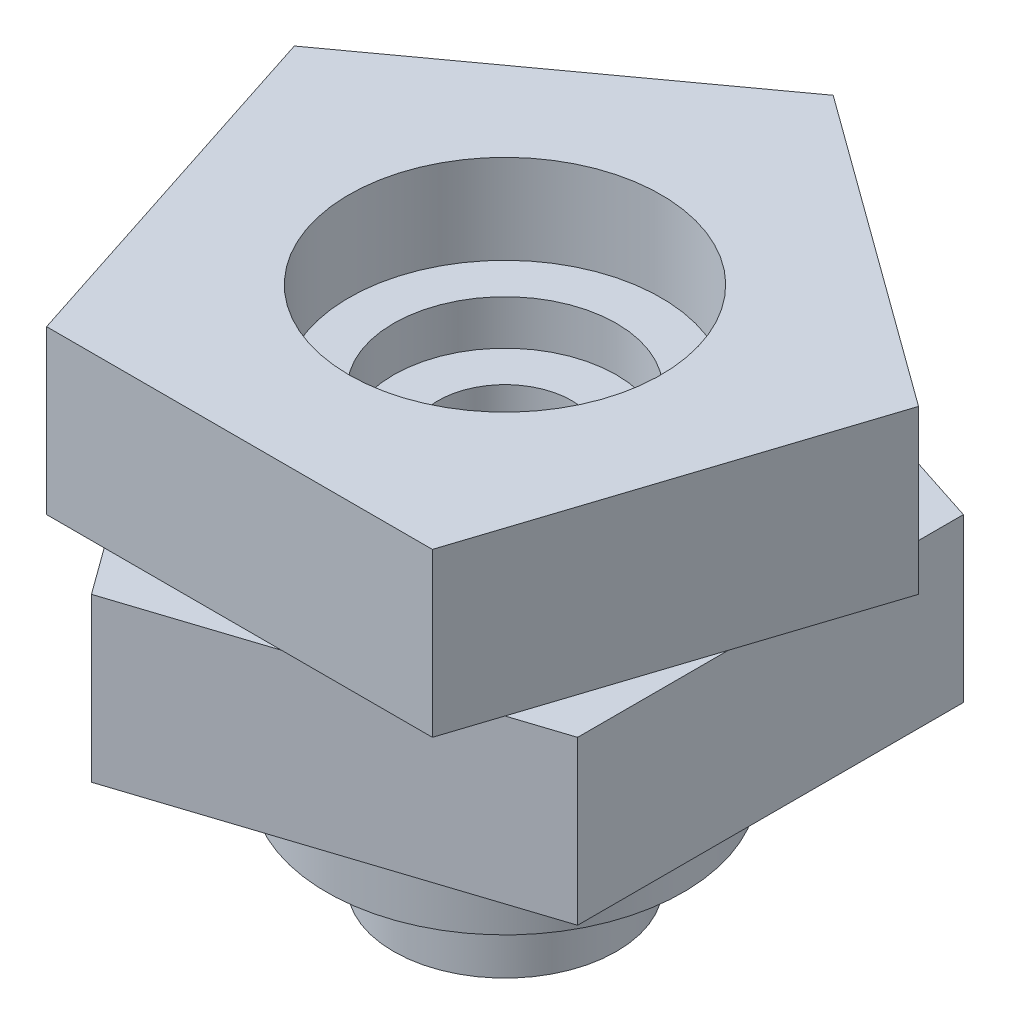
ISO-10303-21;
HEADER;
FILE_DESCRIPTION(('STEP AP214'),'2;1');
FILE_NAME('part.step','',(''),(''),'','','');
FILE_SCHEMA(('AUTOMOTIVE_DESIGN { 1 0 10303 214 1 1 1 1 }'));
ENDSEC;
DATA;
#1=APPLICATION_CONTEXT('core data for automotive mechanical design processes');
#2=APPLICATION_PROTOCOL_DEFINITION('international standard','automotive_design',2000,#1);
#3=PRODUCT_CONTEXT('',#1,'mechanical');
#4=PRODUCT('Part','Part','',(#3));
#5=PRODUCT_RELATED_PRODUCT_CATEGORY('part','',(#4));
#6=PRODUCT_DEFINITION_FORMATION('','',#4);
#7=PRODUCT_DEFINITION_CONTEXT('part definition',#1,'design');
#8=PRODUCT_DEFINITION('design','',#6,#7);
#9=PRODUCT_DEFINITION_SHAPE('','',#8);
#10=(LENGTH_UNIT() NAMED_UNIT(*) SI_UNIT(.MILLI.,.METRE.));
#11=(NAMED_UNIT(*) PLANE_ANGLE_UNIT() SI_UNIT($,.RADIAN.));
#12=(NAMED_UNIT(*) SI_UNIT($,.STERADIAN.) SOLID_ANGLE_UNIT());
#13=UNCERTAINTY_MEASURE_WITH_UNIT(LENGTH_MEASURE(1.E-05),#10,'distance_accuracy_value','');
#14=(GEOMETRIC_REPRESENTATION_CONTEXT(3) GLOBAL_UNCERTAINTY_ASSIGNED_CONTEXT((#13)) GLOBAL_UNIT_ASSIGNED_CONTEXT((#10,
#11,#12)) REPRESENTATION_CONTEXT('',''));
#15=CARTESIAN_POINT('',(0.,0.,0.));
#16=DIRECTION('',(0.,0.,1.));
#17=DIRECTION('',(1.,0.,0.));
#18=AXIS2_PLACEMENT_3D('',#15,#16,#17);
#19=CARTESIAN_POINT('',(0.,-6.15,0.));
#20=DIRECTION('',(0.,-1.,0.));
#21=DIRECTION('',(0.,0.,-1.));
#22=AXIS2_PLACEMENT_3D('',#19,#20,#21);
#23=PLANE('',#22);
#24=CARTESIAN_POINT('',(0.,-6.15,0.));
#25=DIRECTION('',(0.,-1.,0.));
#26=DIRECTION('',(0.,0.,-1.));
#27=AXIS2_PLACEMENT_3D('',#24,#25,#26);
#28=CIRCLE('',#27,4.);
#29=CARTESIAN_POINT('',(0.,-6.15,-4.));
#30=VERTEX_POINT('',#29);
#31=EDGE_CURVE('E167',#30,#30,#28,.T.);
#32=ORIENTED_EDGE('',*,*,#31,.T.);
#33=EDGE_LOOP('',(#32));
#34=FACE_BOUND('',#33,.T.);
#35=CARTESIAN_POINT('',(0.,-6.15,0.));
#36=DIRECTION('',(0.,-1.,0.));
#37=DIRECTION('',(0.,0.,-1.));
#38=AXIS2_PLACEMENT_3D('',#35,#36,#37);
#39=CIRCLE('',#38,2.5);
#40=CARTESIAN_POINT('',(0.,-6.15,2.5));
#41=VERTEX_POINT('',#40);
#42=EDGE_CURVE('E174',#41,#41,#39,.T.);
#43=ORIENTED_EDGE('',*,*,#42,.F.);
#44=EDGE_LOOP('',(#43));
#45=FACE_BOUND('',#44,.T.);
#46=ADVANCED_FACE('F39',(#34,#45),#23,.T.);
#47=CARTESIAN_POINT('',(0.,3.65,0.));
#48=DIRECTION('',(0.,-1.,0.));
#49=DIRECTION('',(0.,0.,-1.));
#50=AXIS2_PLACEMENT_3D('',#47,#48,#49);
#51=CYLINDRICAL_SURFACE('',#50,1.5);
#52=CARTESIAN_POINT('',(0.,0.65,0.));
#53=DIRECTION('',(0.,1.,0.));
#54=DIRECTION('',(0.,0.,1.));
#55=AXIS2_PLACEMENT_3D('',#52,#53,#54);
#56=CIRCLE('',#55,1.5);
#57=CARTESIAN_POINT('',(-1.29903810567666,0.65,0.750000000000001));
#58=VERTEX_POINT('',#57);
#59=CARTESIAN_POINT('',(1.29903810567666,0.65,0.750000000000001));
#60=VERTEX_POINT('',#59);
#61=EDGE_CURVE('E53',#58,#60,#56,.F.);
#62=ORIENTED_EDGE('',*,*,#61,.F.);
#63=DIRECTION('',(0.,-1.,0.));
#64=VECTOR('',#63,1.);
#65=CARTESIAN_POINT('',(-1.29903810567666,3.65,0.750000000000001));
#66=LINE('',#65,#64);
#67=CARTESIAN_POINT('',(-1.29903810567666,-8.05,0.750000000000001));
#68=VERTEX_POINT('',#67);
#69=EDGE_CURVE('E158',#58,#68,#66,.T.);
#70=ORIENTED_EDGE('',*,*,#69,.T.);
#71=CARTESIAN_POINT('',(0.,-8.05,0.));
#72=DIRECTION('',(0.,-1.,0.));
#73=DIRECTION('',(0.,0.,-1.));
#74=AXIS2_PLACEMENT_3D('',#71,#72,#73);
#75=CIRCLE('',#74,1.5);
#76=CARTESIAN_POINT('',(1.29903810567666,-8.05,0.750000000000001));
#77=VERTEX_POINT('',#76);
#78=EDGE_CURVE('E163',#68,#77,#75,.T.);
#79=ORIENTED_EDGE('',*,*,#78,.T.);
#80=DIRECTION('',(0.,-1.,0.));
#81=VECTOR('',#80,1.);
#82=CARTESIAN_POINT('',(1.29903810567666,3.65,0.750000000000001));
#83=LINE('',#82,#81);
#84=EDGE_CURVE('E168',#60,#77,#83,.T.);
#85=ORIENTED_EDGE('',*,*,#84,.F.);
#86=EDGE_LOOP('',(#62,#70,#79,#85));
#87=FACE_BOUND('',#86,.T.);
#88=ADVANCED_FACE('F160',(#87),#51,.F.);
#89=CARTESIAN_POINT('',(-1.29903810567666,3.65,0.750000000000001));
#90=DIRECTION('',(0.,0.,1.));
#91=DIRECTION('',(1.,0.,0.));
#92=AXIS2_PLACEMENT_3D('',#89,#90,#91);
#93=PLANE('',#92);
#94=DIRECTION('',(-1.,0.,0.));
#95=VECTOR('',#94,1.);
#96=CARTESIAN_POINT('',(-1.29903810567666,0.65,0.750000000000001));
#97=LINE('',#96,#95);
#98=EDGE_CURVE('E11',#60,#58,#97,.T.);
#99=ORIENTED_EDGE('',*,*,#98,.F.);
#100=ORIENTED_EDGE('',*,*,#84,.T.);
#101=DIRECTION('',(-1.,0.,0.));
#102=VECTOR('',#101,1.);
#103=CARTESIAN_POINT('',(1.29903810567666,-8.05,0.750000000000001));
#104=LINE('',#103,#102);
#105=EDGE_CURVE('E170',#77,#68,#104,.T.);
#106=ORIENTED_EDGE('',*,*,#105,.T.);
#107=ORIENTED_EDGE('',*,*,#69,.F.);
#108=EDGE_LOOP('',(#99,#100,#106,#107));
#109=FACE_BOUND('',#108,.T.);
#110=ADVANCED_FACE('F171',(#109),#93,.F.);
#111=CARTESIAN_POINT('',(0.,0.,0.));
#112=DIRECTION('',(0.,1.,0.));
#113=DIRECTION('',(0.,0.,1.));
#114=AXIS2_PLACEMENT_3D('',#111,#112,#113);
#115=PLANE('',#114);
#116=DIRECTION('',(0.309016994374949,0.,0.951056516295153));
#117=VECTOR('',#116,1.);
#118=CARTESIAN_POINT('',(-6.99977595993234,0.,-2.2743650785996));
#119=LINE('',#118,#117);
#120=CARTESIAN_POINT('',(-5.37151033820532,0.,2.73692121953803));
#121=VERTEX_POINT('',#120);
#122=CARTESIAN_POINT('',(-4.32609945687259,0.,5.95436507859962));
#123=VERTEX_POINT('',#122);
#124=EDGE_CURVE('E310',#121,#123,#119,.T.);
#125=ORIENTED_EDGE('',*,*,#124,.F.);
#126=DIRECTION('',(0.587785252292473,0.,0.809016994374948));
#127=VECTOR('',#126,1.);
#128=CARTESIAN_POINT('',(-7.36,0.,0.));
#129=LINE('',#128,#127);
#130=CARTESIAN_POINT('',(-3.0339005431274,0.,5.95436507859962));
#131=VERTEX_POINT('',#130);
#132=EDGE_CURVE('E206',#121,#131,#129,.T.);
#133=ORIENTED_EDGE('',*,*,#132,.T.);
#134=DIRECTION('',(1.,0.,0.));
#135=VECTOR('',#134,1.);
#136=CARTESIAN_POINT('',(-4.32609945687259,0.,5.95436507859962));
#137=LINE('',#136,#135);
#138=EDGE_CURVE('E318',#123,#131,#137,.T.);
#139=ORIENTED_EDGE('',*,*,#138,.F.);
#140=EDGE_LOOP('',(#125,#133,#139));
#141=FACE_BOUND('',#140,.T.);
#142=ADVANCED_FACE('F443',(#141),#115,.F.);
#143=CARTESIAN_POINT('',(0.943078780461964,0.,5.95436507859961));
#144=VERTEX_POINT('',#143);
#145=CARTESIAN_POINT('',(4.32609945687261,0.,5.95436507859961));
#146=VERTEX_POINT('',#145);
#147=EDGE_CURVE('E316',#144,#146,#137,.T.);
#148=ORIENTED_EDGE('',*,*,#147,.F.);
#149=DIRECTION('',(0.951056516295154,0.,-0.309016994374947));
#150=VECTOR('',#149,1.);
#151=CARTESIAN_POINT('',(-2.27436507859962,0.,6.99977595993233));
#152=LINE('',#151,#150);
#153=CARTESIAN_POINT('',(4.72541088133272,0.,4.72541088133272));
#154=VERTEX_POINT('',#153);
#155=EDGE_CURVE('E247',#144,#154,#152,.T.);
#156=ORIENTED_EDGE('',*,*,#155,.T.);
#157=DIRECTION('',(0.309016994374946,0.,-0.951056516295154));
#158=VECTOR('',#157,1.);
#159=CARTESIAN_POINT('',(4.32609945687261,0.,5.95436507859961));
#160=LINE('',#159,#158);
#161=EDGE_CURVE('E287',#146,#154,#160,.T.);
#162=ORIENTED_EDGE('',*,*,#161,.F.);
#163=EDGE_LOOP('',(#148,#156,#162));
#164=FACE_BOUND('',#163,.T.);
#165=ADVANCED_FACE('F385',(#164),#115,.F.);
#166=CARTESIAN_POINT('',(5.95436507859961,0.,0.943078780461952));
#167=VERTEX_POINT('',#166);
#168=CARTESIAN_POINT('',(6.99977595993233,0.,-2.27436507859963));
#169=VERTEX_POINT('',#168);
#170=EDGE_CURVE('E322',#167,#169,#160,.T.);
#171=ORIENTED_EDGE('',*,*,#170,.F.);
#172=DIRECTION('',(0.,0.,-1.));
#173=VECTOR('',#172,1.);
#174=CARTESIAN_POINT('',(5.95436507859961,0.,4.32609945687261));
#175=LINE('',#174,#173);
#176=CARTESIAN_POINT('',(5.95436507859962,0.,-3.0339005431274));
#177=VERTEX_POINT('',#176);
#178=EDGE_CURVE('E253',#167,#177,#175,.T.);
#179=ORIENTED_EDGE('',*,*,#178,.T.);
#180=DIRECTION('',(-0.809016994374948,0.,-0.587785252292473));
#181=VECTOR('',#180,1.);
#182=CARTESIAN_POINT('',(6.99977595993233,0.,-2.27436507859963));
#183=LINE('',#182,#181);
#184=EDGE_CURVE('E300',#169,#177,#183,.T.);
#185=ORIENTED_EDGE('',*,*,#184,.F.);
#186=EDGE_LOOP('',(#171,#179,#185));
#187=FACE_BOUND('',#186,.T.);
#188=ADVANCED_FACE('F406',(#187),#115,.F.);
#189=CARTESIAN_POINT('',(2.73692121953806,0.,-5.37151033820531));
#190=VERTEX_POINT('',#189);
#191=CARTESIAN_POINT('',(0.,0.,-7.36));
#192=VERTEX_POINT('',#191);
#193=EDGE_CURVE('E266',#190,#192,#183,.T.);
#194=ORIENTED_EDGE('',*,*,#193,.F.);
#195=DIRECTION('',(-0.951056516295154,0.,-0.309016994374948));
#196=VECTOR('',#195,1.);
#197=CARTESIAN_POINT('',(5.95436507859962,0.,-4.3260994568726));
#198=LINE('',#197,#196);
#199=CARTESIAN_POINT('',(-1.04541088133272,0.,-6.60046453547222));
#200=VERTEX_POINT('',#199);
#201=EDGE_CURVE('E258',#190,#200,#198,.T.);
#202=ORIENTED_EDGE('',*,*,#201,.T.);
#203=DIRECTION('',(-0.809016994374947,0.,0.587785252292474));
#204=VECTOR('',#203,1.);
#205=CARTESIAN_POINT('',(0.,0.,-7.36));
#206=LINE('',#205,#204);
#207=EDGE_CURVE('E306',#192,#200,#206,.T.);
#208=ORIENTED_EDGE('',*,*,#207,.F.);
#209=EDGE_LOOP('',(#194,#202,#208));
#210=FACE_BOUND('',#209,.T.);
#211=ADVANCED_FACE('F424',(#210),#115,.F.);
#212=CARTESIAN_POINT('',(6.99977595993233,3.65,-2.27436507859963));
#213=DIRECTION('',(-0.587785252292473,0.,0.809016994374948));
#214=DIRECTION('',(0.809016994374948,0.,0.587785252292473));
#215=AXIS2_PLACEMENT_3D('',#212,#213,#214);
#216=PLANE('',#215);
#217=ORIENTED_EDGE('',*,*,#184,.T.);
#218=EDGE_CURVE('E305',#177,#190,#183,.T.);
#219=ORIENTED_EDGE('',*,*,#218,.T.);
#220=ORIENTED_EDGE('',*,*,#193,.T.);
#221=DIRECTION('',(0.,-1.,0.));
#222=VECTOR('',#221,1.);
#223=CARTESIAN_POINT('',(0.,3.65,-7.36));
#224=LINE('',#223,#222);
#225=CARTESIAN_POINT('',(0.,3.65,-7.36));
#226=VERTEX_POINT('',#225);
#227=EDGE_CURVE('E342',#226,#192,#224,.T.);
#228=ORIENTED_EDGE('',*,*,#227,.F.);
#229=DIRECTION('',(-0.809016994374948,0.,-0.587785252292473));
#230=VECTOR('',#229,1.);
#231=CARTESIAN_POINT('',(6.99977595993233,3.65,-2.27436507859963));
#232=LINE('',#231,#230);
#233=CARTESIAN_POINT('',(6.99977595993233,3.65,-2.27436507859963));
#234=VERTEX_POINT('',#233);
#235=EDGE_CURVE('E282',#234,#226,#232,.T.);
#236=ORIENTED_EDGE('',*,*,#235,.F.);
#237=DIRECTION('',(0.,-1.,0.));
#238=VECTOR('',#237,1.);
#239=CARTESIAN_POINT('',(6.99977595993233,3.65,-2.27436507859963));
#240=LINE('',#239,#238);
#241=EDGE_CURVE('E299',#234,#169,#240,.T.);
#242=ORIENTED_EDGE('',*,*,#241,.T.);
#243=EDGE_LOOP('',(#217,#219,#220,#228,#236,#242));
#244=FACE_BOUND('',#243,.T.);
#245=ADVANCED_FACE('F41',(#244),#216,.F.);
#246=CARTESIAN_POINT('',(0.,3.65,-7.36));
#247=DIRECTION('',(0.587785252292474,0.,0.809016994374947));
#248=DIRECTION('',(0.809016994374947,0.,-0.587785252292474));
#249=AXIS2_PLACEMENT_3D('',#246,#247,#248);
#250=PLANE('',#249);
#251=ORIENTED_EDGE('',*,*,#207,.T.);
#252=CARTESIAN_POINT('',(-4.2628547403943,0.,-4.26285474039429));
#253=VERTEX_POINT('',#252);
#254=EDGE_CURVE('E311',#200,#253,#206,.T.);
#255=ORIENTED_EDGE('',*,*,#254,.T.);
#256=CARTESIAN_POINT('',(-6.99977595993234,0.,-2.2743650785996));
#257=VERTEX_POINT('',#256);
#258=EDGE_CURVE('E304',#253,#257,#206,.T.);
#259=ORIENTED_EDGE('',*,*,#258,.T.);
#260=DIRECTION('',(0.,-1.,0.));
#261=VECTOR('',#260,1.);
#262=CARTESIAN_POINT('',(-6.99977595993234,3.65,-2.2743650785996));
#263=LINE('',#262,#261);
#264=CARTESIAN_POINT('',(-6.99977595993234,3.65,-2.2743650785996));
#265=VERTEX_POINT('',#264);
#266=EDGE_CURVE('E339',#265,#257,#263,.T.);
#267=ORIENTED_EDGE('',*,*,#266,.F.);
#268=DIRECTION('',(-0.809016994374947,0.,0.587785252292474));
#269=VECTOR('',#268,1.);
#270=CARTESIAN_POINT('',(0.,3.65,-7.36));
#271=LINE('',#270,#269);
#272=EDGE_CURVE('E286',#226,#265,#271,.T.);
#273=ORIENTED_EDGE('',*,*,#272,.F.);
#274=ORIENTED_EDGE('',*,*,#227,.T.);
#275=EDGE_LOOP('',(#251,#255,#259,#267,#273,#274));
#276=FACE_BOUND('',#275,.T.);
#277=ADVANCED_FACE('F426',(#276),#250,.F.);
#278=CARTESIAN_POINT('',(-6.99977595993234,3.65,-2.2743650785996));
#279=DIRECTION('',(0.951056516295153,0.,-0.309016994374949));
#280=DIRECTION('',(-0.309016994374949,0.,-0.951056516295153));
#281=AXIS2_PLACEMENT_3D('',#278,#279,#280);
#282=PLANE('',#281);
#283=CARTESIAN_POINT('',(-6.60046453547222,0.,-1.04541088133271));
#284=VERTEX_POINT('',#283);
#285=EDGE_CURVE('E312',#257,#284,#119,.T.);
#286=ORIENTED_EDGE('',*,*,#285,.T.);
#287=EDGE_CURVE('E317',#284,#121,#119,.T.);
#288=ORIENTED_EDGE('',*,*,#287,.T.);
#289=ORIENTED_EDGE('',*,*,#124,.T.);
#290=DIRECTION('',(0.,-1.,0.));
#291=VECTOR('',#290,1.);
#292=CARTESIAN_POINT('',(-4.32609945687259,3.65,5.95436507859962));
#293=LINE('',#292,#291);
#294=CARTESIAN_POINT('',(-4.32609945687259,3.65,5.95436507859962));
#295=VERTEX_POINT('',#294);
#296=EDGE_CURVE('E335',#295,#123,#293,.T.);
#297=ORIENTED_EDGE('',*,*,#296,.F.);
#298=DIRECTION('',(0.309016994374949,0.,0.951056516295153));
#299=VECTOR('',#298,1.);
#300=CARTESIAN_POINT('',(-6.99977595993234,3.65,-2.2743650785996));
#301=LINE('',#300,#299);
#302=EDGE_CURVE('E290',#265,#295,#301,.T.);
#303=ORIENTED_EDGE('',*,*,#302,.F.);
#304=ORIENTED_EDGE('',*,*,#266,.T.);
#305=EDGE_LOOP('',(#286,#288,#289,#297,#303,#304));
#306=FACE_BOUND('',#305,.T.);
#307=ADVANCED_FACE('F436',(#306),#282,.F.);
#308=CARTESIAN_POINT('',(-4.32609945687259,3.65,5.95436507859962));
#309=DIRECTION('',(0.,0.,-1.));
#310=DIRECTION('',(-1.,0.,0.));
#311=AXIS2_PLACEMENT_3D('',#308,#309,#310);
#312=PLANE('',#311);
#313=ORIENTED_EDGE('',*,*,#138,.T.);
#314=EDGE_CURVE('E323',#131,#144,#137,.T.);
#315=ORIENTED_EDGE('',*,*,#314,.T.);
#316=ORIENTED_EDGE('',*,*,#147,.T.);
#317=DIRECTION('',(0.,-1.,0.));
#318=VECTOR('',#317,1.);
#319=CARTESIAN_POINT('',(4.32609945687261,3.65,5.95436507859961));
#320=LINE('',#319,#318);
#321=CARTESIAN_POINT('',(4.32609945687261,3.65,5.95436507859961));
#322=VERTEX_POINT('',#321);
#323=EDGE_CURVE('E331',#322,#146,#320,.T.);
#324=ORIENTED_EDGE('',*,*,#323,.F.);
#325=DIRECTION('',(1.,0.,0.));
#326=VECTOR('',#325,1.);
#327=CARTESIAN_POINT('',(-4.32609945687259,3.65,5.95436507859962));
#328=LINE('',#327,#326);
#329=EDGE_CURVE('E293',#295,#322,#328,.T.);
#330=ORIENTED_EDGE('',*,*,#329,.F.);
#331=ORIENTED_EDGE('',*,*,#296,.T.);
#332=EDGE_LOOP('',(#313,#315,#316,#324,#330,#331));
#333=FACE_BOUND('',#332,.T.);
#334=ADVANCED_FACE('F394',(#333),#312,.F.);
#335=CARTESIAN_POINT('',(4.32609945687261,3.65,5.95436507859961));
#336=DIRECTION('',(-0.951056516295154,0.,-0.309016994374946));
#337=DIRECTION('',(-0.309016994374946,0.,0.951056516295154));
#338=AXIS2_PLACEMENT_3D('',#335,#336,#337);
#339=PLANE('',#338);
#340=ORIENTED_EDGE('',*,*,#161,.T.);
#341=EDGE_CURVE('E327',#154,#167,#160,.T.);
#342=ORIENTED_EDGE('',*,*,#341,.T.);
#343=ORIENTED_EDGE('',*,*,#170,.T.);
#344=ORIENTED_EDGE('',*,*,#241,.F.);
#345=DIRECTION('',(0.309016994374946,0.,-0.951056516295154));
#346=VECTOR('',#345,1.);
#347=CARTESIAN_POINT('',(4.32609945687261,3.65,5.95436507859961));
#348=LINE('',#347,#346);
#349=EDGE_CURVE('E296',#322,#234,#348,.T.);
#350=ORIENTED_EDGE('',*,*,#349,.F.);
#351=ORIENTED_EDGE('',*,*,#323,.T.);
#352=EDGE_LOOP('',(#340,#342,#343,#344,#350,#351));
#353=FACE_BOUND('',#352,.T.);
#354=ADVANCED_FACE('F388',(#353),#339,.F.);
#355=CARTESIAN_POINT('',(0.,3.65,0.));
#356=DIRECTION('',(0.,1.,0.));
#357=DIRECTION('',(0.,0.,1.));
#358=AXIS2_PLACEMENT_3D('',#355,#356,#357);
#359=PLANE('',#358);
#360=CARTESIAN_POINT('',(0.,3.65,0.));
#361=DIRECTION('',(0.,1.,0.));
#362=DIRECTION('',(0.,0.,1.));
#363=AXIS2_PLACEMENT_3D('',#360,#361,#362);
#364=CIRCLE('',#363,3.5);
#365=CARTESIAN_POINT('',(0.,3.65,3.5));
#366=VERTEX_POINT('',#365);
#367=EDGE_CURVE('E202',#366,#366,#364,.T.);
#368=ORIENTED_EDGE('',*,*,#367,.F.);
#369=EDGE_LOOP('',(#368));
#370=FACE_BOUND('',#369,.T.);
#371=ORIENTED_EDGE('',*,*,#235,.T.);
#372=ORIENTED_EDGE('',*,*,#272,.T.);
#373=ORIENTED_EDGE('',*,*,#302,.T.);
#374=ORIENTED_EDGE('',*,*,#329,.T.);
#375=ORIENTED_EDGE('',*,*,#349,.T.);
#376=EDGE_LOOP('',(#371,#372,#373,#374,#375));
#377=FACE_BOUND('',#376,.T.);
#378=ADVANCED_FACE('F441',(#370,#377),#359,.T.);
#379=ORIENTED_EDGE('',*,*,#258,.F.);
#380=DIRECTION('',(-0.587785252292474,0.,0.809016994374947));
#381=VECTOR('',#380,1.);
#382=CARTESIAN_POINT('',(-2.27436507859961,0.,-6.99977595993233));
#383=LINE('',#382,#381);
#384=EDGE_CURVE('E262',#253,#284,#383,.T.);
#385=ORIENTED_EDGE('',*,*,#384,.T.);
#386=ORIENTED_EDGE('',*,*,#285,.F.);
#387=EDGE_LOOP('',(#379,#385,#386));
#388=FACE_BOUND('',#387,.T.);
#389=ADVANCED_FACE('F439',(#388),#115,.F.);
#390=CARTESIAN_POINT('',(0.,0.,0.));
#391=DIRECTION('',(0.,1.,0.));
#392=DIRECTION('',(0.,0.,1.));
#393=AXIS2_PLACEMENT_3D('',#390,#391,#392);
#394=PLANE('',#393);
#395=ORIENTED_EDGE('',*,*,#218,.F.);
#396=CARTESIAN_POINT('',(5.95436507859962,0.,-4.3260994568726));
#397=VERTEX_POINT('',#396);
#398=EDGE_CURVE('E246',#177,#397,#175,.T.);
#399=ORIENTED_EDGE('',*,*,#398,.T.);
#400=EDGE_CURVE('E254',#397,#190,#198,.T.);
#401=ORIENTED_EDGE('',*,*,#400,.T.);
#402=EDGE_LOOP('',(#395,#399,#401));
#403=FACE_BOUND('',#402,.T.);
#404=ADVANCED_FACE('F413',(#403),#394,.T.);
#405=ORIENTED_EDGE('',*,*,#341,.F.);
#406=CARTESIAN_POINT('',(5.95436507859961,0.,4.32609945687261));
#407=VERTEX_POINT('',#406);
#408=EDGE_CURVE('E241',#154,#407,#152,.T.);
#409=ORIENTED_EDGE('',*,*,#408,.T.);
#410=EDGE_CURVE('E248',#407,#167,#175,.T.);
#411=ORIENTED_EDGE('',*,*,#410,.T.);
#412=EDGE_LOOP('',(#405,#409,#411));
#413=FACE_BOUND('',#412,.T.);
#414=ADVANCED_FACE('F448',(#413),#394,.T.);
#415=ORIENTED_EDGE('',*,*,#314,.F.);
#416=CARTESIAN_POINT('',(-2.27436507859962,0.,6.99977595993233));
#417=VERTEX_POINT('',#416);
#418=EDGE_CURVE('E211',#131,#417,#129,.T.);
#419=ORIENTED_EDGE('',*,*,#418,.T.);
#420=EDGE_CURVE('E242',#417,#144,#152,.T.);
#421=ORIENTED_EDGE('',*,*,#420,.T.);
#422=EDGE_LOOP('',(#415,#419,#421));
#423=FACE_BOUND('',#422,.T.);
#424=ADVANCED_FACE('F375',(#423),#394,.T.);
#425=ORIENTED_EDGE('',*,*,#287,.F.);
#426=CARTESIAN_POINT('',(-7.36,0.,0.));
#427=VERTEX_POINT('',#426);
#428=EDGE_CURVE('E61',#284,#427,#383,.T.);
#429=ORIENTED_EDGE('',*,*,#428,.T.);
#430=EDGE_CURVE('E237',#427,#121,#129,.T.);
#431=ORIENTED_EDGE('',*,*,#430,.T.);
#432=EDGE_LOOP('',(#425,#429,#431));
#433=FACE_BOUND('',#432,.T.);
#434=ADVANCED_FACE('F356',(#433),#394,.T.);
#435=ORIENTED_EDGE('',*,*,#254,.F.);
#436=CARTESIAN_POINT('',(-2.27436507859961,0.,-6.99977595993233));
#437=VERTEX_POINT('',#436);
#438=EDGE_CURVE('E252',#200,#437,#198,.T.);
#439=ORIENTED_EDGE('',*,*,#438,.T.);
#440=EDGE_CURVE('E220',#437,#253,#383,.T.);
#441=ORIENTED_EDGE('',*,*,#440,.T.);
#442=EDGE_LOOP('',(#435,#439,#441));
#443=FACE_BOUND('',#442,.T.);
#444=ADVANCED_FACE('F450',(#443),#394,.T.);
#445=CARTESIAN_POINT('',(-7.36,-3.65,0.));
#446=DIRECTION('',(-0.809016994374948,0.,0.587785252292473));
#447=DIRECTION('',(0.587785252292473,0.,0.809016994374948));
#448=AXIS2_PLACEMENT_3D('',#445,#446,#447);
#449=PLANE('',#448);
#450=ORIENTED_EDGE('',*,*,#430,.F.);
#451=DIRECTION('',(0.,1.,0.));
#452=VECTOR('',#451,1.);
#453=CARTESIAN_POINT('',(-7.36,-3.65,0.));
#454=LINE('',#453,#452);
#455=CARTESIAN_POINT('',(-7.36,-3.65,0.));
#456=VERTEX_POINT('',#455);
#457=EDGE_CURVE('E263',#456,#427,#454,.T.);
#458=ORIENTED_EDGE('',*,*,#457,.F.);
#459=DIRECTION('',(0.587785252292473,0.,0.809016994374948));
#460=VECTOR('',#459,1.);
#461=CARTESIAN_POINT('',(-7.36,-3.65,0.));
#462=LINE('',#461,#460);
#463=CARTESIAN_POINT('',(-2.27436507859962,-3.65,6.99977595993233));
#464=VERTEX_POINT('',#463);
#465=EDGE_CURVE('E215',#456,#464,#462,.T.);
#466=ORIENTED_EDGE('',*,*,#465,.T.);
#467=DIRECTION('',(0.,1.,0.));
#468=VECTOR('',#467,1.);
#469=CARTESIAN_POINT('',(-2.27436507859962,-3.65,6.99977595993233));
#470=LINE('',#469,#468);
#471=EDGE_CURVE('E236',#464,#417,#470,.T.);
#472=ORIENTED_EDGE('',*,*,#471,.T.);
#473=ORIENTED_EDGE('',*,*,#418,.F.);
#474=ORIENTED_EDGE('',*,*,#132,.F.);
#475=EDGE_LOOP('',(#450,#458,#466,#472,#473,#474));
#476=FACE_BOUND('',#475,.T.);
#477=ADVANCED_FACE('F365',(#476),#449,.T.);
#478=CARTESIAN_POINT('',(-2.27436507859961,-3.65,-6.99977595993233));
#479=DIRECTION('',(-0.809016994374947,0.,-0.587785252292474));
#480=DIRECTION('',(-0.587785252292474,0.,0.809016994374947));
#481=AXIS2_PLACEMENT_3D('',#478,#479,#480);
#482=PLANE('',#481);
#483=ORIENTED_EDGE('',*,*,#440,.F.);
#484=DIRECTION('',(0.,1.,0.));
#485=VECTOR('',#484,1.);
#486=CARTESIAN_POINT('',(-2.27436507859961,-3.65,-6.99977595993233));
#487=LINE('',#486,#485);
#488=CARTESIAN_POINT('',(-2.27436507859961,-3.65,-6.99977595993233));
#489=VERTEX_POINT('',#488);
#490=EDGE_CURVE('E267',#489,#437,#487,.T.);
#491=ORIENTED_EDGE('',*,*,#490,.F.);
#492=DIRECTION('',(-0.587785252292474,0.,0.809016994374947));
#493=VECTOR('',#492,1.);
#494=CARTESIAN_POINT('',(-2.27436507859961,-3.65,-6.99977595993233));
#495=LINE('',#494,#493);
#496=EDGE_CURVE('E232',#489,#456,#495,.T.);
#497=ORIENTED_EDGE('',*,*,#496,.T.);
#498=ORIENTED_EDGE('',*,*,#457,.T.);
#499=ORIENTED_EDGE('',*,*,#428,.F.);
#500=ORIENTED_EDGE('',*,*,#384,.F.);
#501=EDGE_LOOP('',(#483,#491,#497,#498,#499,#500));
#502=FACE_BOUND('',#501,.T.);
#503=ADVANCED_FACE('F361',(#502),#482,.T.);
#504=CARTESIAN_POINT('',(5.95436507859962,-3.65,-4.3260994568726));
#505=DIRECTION('',(0.309016994374948,0.,-0.951056516295153));
#506=DIRECTION('',(-0.951056516295154,0.,-0.309016994374948));
#507=AXIS2_PLACEMENT_3D('',#504,#505,#506);
#508=PLANE('',#507);
#509=ORIENTED_EDGE('',*,*,#400,.F.);
#510=DIRECTION('',(0.,1.,0.));
#511=VECTOR('',#510,1.);
#512=CARTESIAN_POINT('',(5.95436507859962,-3.65,-4.3260994568726));
#513=LINE('',#512,#511);
#514=CARTESIAN_POINT('',(5.95436507859962,-3.65,-4.3260994568726));
#515=VERTEX_POINT('',#514);
#516=EDGE_CURVE('E271',#515,#397,#513,.T.);
#517=ORIENTED_EDGE('',*,*,#516,.F.);
#518=DIRECTION('',(-0.951056516295154,0.,-0.309016994374948));
#519=VECTOR('',#518,1.);
#520=CARTESIAN_POINT('',(5.95436507859962,-3.65,-4.3260994568726));
#521=LINE('',#520,#519);
#522=EDGE_CURVE('E228',#515,#489,#521,.T.);
#523=ORIENTED_EDGE('',*,*,#522,.T.);
#524=ORIENTED_EDGE('',*,*,#490,.T.);
#525=ORIENTED_EDGE('',*,*,#438,.F.);
#526=ORIENTED_EDGE('',*,*,#201,.F.);
#527=EDGE_LOOP('',(#509,#517,#523,#524,#525,#526));
#528=FACE_BOUND('',#527,.T.);
#529=ADVANCED_FACE('F420',(#528),#508,.T.);
#530=CARTESIAN_POINT('',(5.95436507859961,-3.65,4.32609945687261));
#531=DIRECTION('',(1.,0.,0.));
#532=DIRECTION('',(0.,0.,-1.));
#533=AXIS2_PLACEMENT_3D('',#530,#531,#532);
#534=PLANE('',#533);
#535=ORIENTED_EDGE('',*,*,#410,.F.);
#536=DIRECTION('',(0.,1.,0.));
#537=VECTOR('',#536,1.);
#538=CARTESIAN_POINT('',(5.95436507859961,-3.65,4.32609945687261));
#539=LINE('',#538,#537);
#540=CARTESIAN_POINT('',(5.95436507859961,-3.65,4.32609945687261));
#541=VERTEX_POINT('',#540);
#542=EDGE_CURVE('E275',#541,#407,#539,.T.);
#543=ORIENTED_EDGE('',*,*,#542,.F.);
#544=DIRECTION('',(0.,0.,-1.));
#545=VECTOR('',#544,1.);
#546=CARTESIAN_POINT('',(5.95436507859961,-3.65,4.32609945687261));
#547=LINE('',#546,#545);
#548=EDGE_CURVE('E224',#541,#515,#547,.T.);
#549=ORIENTED_EDGE('',*,*,#548,.T.);
#550=ORIENTED_EDGE('',*,*,#516,.T.);
#551=ORIENTED_EDGE('',*,*,#398,.F.);
#552=ORIENTED_EDGE('',*,*,#178,.F.);
#553=EDGE_LOOP('',(#535,#543,#549,#550,#551,#552));
#554=FACE_BOUND('',#553,.T.);
#555=ADVANCED_FACE('F416',(#554),#534,.T.);
#556=CARTESIAN_POINT('',(-2.27436507859962,-3.65,6.99977595993233));
#557=DIRECTION('',(0.309016994374947,0.,0.951056516295154));
#558=DIRECTION('',(0.951056516295154,0.,-0.309016994374947));
#559=AXIS2_PLACEMENT_3D('',#556,#557,#558);
#560=PLANE('',#559);
#561=ORIENTED_EDGE('',*,*,#420,.F.);
#562=ORIENTED_EDGE('',*,*,#471,.F.);
#563=DIRECTION('',(0.951056516295154,0.,-0.309016994374947));
#564=VECTOR('',#563,1.);
#565=CARTESIAN_POINT('',(-2.27436507859962,-3.65,6.99977595993233));
#566=LINE('',#565,#564);
#567=EDGE_CURVE('E219',#464,#541,#566,.T.);
#568=ORIENTED_EDGE('',*,*,#567,.T.);
#569=ORIENTED_EDGE('',*,*,#542,.T.);
#570=ORIENTED_EDGE('',*,*,#408,.F.);
#571=ORIENTED_EDGE('',*,*,#155,.F.);
#572=EDGE_LOOP('',(#561,#562,#568,#569,#570,#571));
#573=FACE_BOUND('',#572,.T.);
#574=ADVANCED_FACE('F381',(#573),#560,.T.);
#575=CARTESIAN_POINT('',(0.,-3.65,0.));
#576=DIRECTION('',(0.,1.,0.));
#577=DIRECTION('',(0.,0.,1.));
#578=AXIS2_PLACEMENT_3D('',#575,#576,#577);
#579=PLANE('',#578);
#580=CARTESIAN_POINT('',(0.,-3.65,0.));
#581=DIRECTION('',(0.,-1.,0.));
#582=DIRECTION('',(0.,0.,-1.));
#583=AXIS2_PLACEMENT_3D('',#580,#581,#582);
#584=CIRCLE('',#583,4.);
#585=CARTESIAN_POINT('',(0.,-3.65,-4.));
#586=VERTEX_POINT('',#585);
#587=EDGE_CURVE('E48',#586,#586,#584,.T.);
#588=ORIENTED_EDGE('',*,*,#587,.F.);
#589=EDGE_LOOP('',(#588));
#590=FACE_BOUND('',#589,.T.);
#591=ORIENTED_EDGE('',*,*,#465,.F.);
#592=ORIENTED_EDGE('',*,*,#496,.F.);
#593=ORIENTED_EDGE('',*,*,#522,.F.);
#594=ORIENTED_EDGE('',*,*,#548,.F.);
#595=ORIENTED_EDGE('',*,*,#567,.F.);
#596=EDGE_LOOP('',(#591,#592,#593,#594,#595));
#597=FACE_BOUND('',#596,.T.);
#598=ADVANCED_FACE('F478',(#590,#597),#579,.F.);
#599=CARTESIAN_POINT('',(0.,1.65,0.));
#600=DIRECTION('',(0.,1.,0.));
#601=DIRECTION('',(0.,0.,1.));
#602=AXIS2_PLACEMENT_3D('',#599,#600,#601);
#603=CYLINDRICAL_SURFACE('',#602,3.5);
#604=CARTESIAN_POINT('',(0.,1.65,0.));
#605=DIRECTION('',(0.,1.,0.));
#606=DIRECTION('',(0.,0.,1.));
#607=AXIS2_PLACEMENT_3D('',#604,#605,#606);
#608=CIRCLE('',#607,3.5);
#609=CARTESIAN_POINT('',(0.,1.65,3.5));
#610=VERTEX_POINT('',#609);
#611=EDGE_CURVE('E207',#610,#610,#608,.T.);
#612=ORIENTED_EDGE('',*,*,#611,.F.);
#613=EDGE_LOOP('',(#612));
#614=FACE_BOUND('',#613,.T.);
#615=ORIENTED_EDGE('',*,*,#367,.T.);
#616=EDGE_LOOP('',(#615));
#617=FACE_BOUND('',#616,.T.);
#618=ADVANCED_FACE('F474',(#614,#617),#603,.F.);
#619=CARTESIAN_POINT('',(0.,1.65,0.));
#620=DIRECTION('',(0.,1.,0.));
#621=DIRECTION('',(0.,0.,1.));
#622=AXIS2_PLACEMENT_3D('',#619,#620,#621);
#623=PLANE('',#622);
#624=CARTESIAN_POINT('',(0.,1.65,0.));
#625=DIRECTION('',(0.,1.,0.));
#626=DIRECTION('',(0.,0.,1.));
#627=AXIS2_PLACEMENT_3D('',#624,#625,#626);
#628=CIRCLE('',#627,2.5);
#629=CARTESIAN_POINT('',(0.,1.65,2.5));
#630=VERTEX_POINT('',#629);
#631=EDGE_CURVE('E184',#630,#630,#628,.T.);
#632=ORIENTED_EDGE('',*,*,#631,.F.);
#633=EDGE_LOOP('',(#632));
#634=FACE_BOUND('',#633,.T.);
#635=ORIENTED_EDGE('',*,*,#611,.T.);
#636=EDGE_LOOP('',(#635));
#637=FACE_BOUND('',#636,.T.);
#638=ADVANCED_FACE('F470',(#634,#637),#623,.T.);
#639=CARTESIAN_POINT('',(0.,-6.15,0.));
#640=DIRECTION('',(0.,1.,0.));
#641=DIRECTION('',(0.,0.,1.));
#642=AXIS2_PLACEMENT_3D('',#639,#640,#641);
#643=CYLINDRICAL_SURFACE('',#642,4.);
#644=ORIENTED_EDGE('',*,*,#31,.F.);
#645=EDGE_LOOP('',(#644));
#646=FACE_BOUND('',#645,.T.);
#647=ORIENTED_EDGE('',*,*,#587,.T.);
#648=EDGE_LOOP('',(#647));
#649=FACE_BOUND('',#648,.T.);
#650=ADVANCED_FACE('F466',(#646,#649),#643,.T.);
#651=CARTESIAN_POINT('',(0.,0.65,0.));
#652=DIRECTION('',(0.,1.,0.));
#653=DIRECTION('',(0.,0.,1.));
#654=AXIS2_PLACEMENT_3D('',#651,#652,#653);
#655=PLANE('',#654);
#656=CARTESIAN_POINT('',(0.,0.65,0.));
#657=DIRECTION('',(0.,1.,0.));
#658=DIRECTION('',(0.,0.,1.));
#659=AXIS2_PLACEMENT_3D('',#656,#657,#658);
#660=CIRCLE('',#659,2.5);
#661=CARTESIAN_POINT('',(0.,0.65,2.5));
#662=VERTEX_POINT('',#661);
#663=EDGE_CURVE('E188',#662,#662,#660,.T.);
#664=ORIENTED_EDGE('',*,*,#663,.T.);
#665=EDGE_LOOP('',(#664));
#666=FACE_BOUND('',#665,.T.);
#667=ORIENTED_EDGE('',*,*,#61,.T.);
#668=ORIENTED_EDGE('',*,*,#98,.T.);
#669=EDGE_LOOP('',(#667,#668));
#670=FACE_BOUND('',#669,.T.);
#671=ADVANCED_FACE('F469',(#666,#670),#655,.T.);
#672=CARTESIAN_POINT('',(0.,0.65,0.));
#673=DIRECTION('',(0.,1.,0.));
#674=DIRECTION('',(0.,0.,1.));
#675=AXIS2_PLACEMENT_3D('',#672,#673,#674);
#676=CYLINDRICAL_SURFACE('',#675,2.5);
#677=ORIENTED_EDGE('',*,*,#663,.F.);
#678=EDGE_LOOP('',(#677));
#679=FACE_BOUND('',#678,.T.);
#680=ORIENTED_EDGE('',*,*,#631,.T.);
#681=EDGE_LOOP('',(#680));
#682=FACE_BOUND('',#681,.T.);
#683=ADVANCED_FACE('F605',(#679,#682),#676,.F.);
#684=CARTESIAN_POINT('',(0.,-8.05,0.));
#685=DIRECTION('',(0.,-1.,0.));
#686=DIRECTION('',(0.,0.,-1.));
#687=AXIS2_PLACEMENT_3D('',#684,#685,#686);
#688=PLANE('',#687);
#689=CARTESIAN_POINT('',(0.,-8.05,0.));
#690=DIRECTION('',(0.,-1.,0.));
#691=DIRECTION('',(0.,0.,-1.));
#692=AXIS2_PLACEMENT_3D('',#689,#690,#691);
#693=CIRCLE('',#692,2.5);
#694=CARTESIAN_POINT('',(0.,-8.05,2.5));
#695=VERTEX_POINT('',#694);
#696=EDGE_CURVE('E180',#695,#695,#693,.T.);
#697=ORIENTED_EDGE('',*,*,#696,.T.);
#698=EDGE_LOOP('',(#697));
#699=FACE_BOUND('',#698,.T.);
#700=ORIENTED_EDGE('',*,*,#105,.F.);
#701=ORIENTED_EDGE('',*,*,#78,.F.);
#702=EDGE_LOOP('',(#700,#701));
#703=FACE_BOUND('',#702,.T.);
#704=ADVANCED_FACE('F176',(#699,#703),#688,.T.);
#705=CARTESIAN_POINT('',(0.,-8.05,0.));
#706=DIRECTION('',(0.,1.,0.));
#707=DIRECTION('',(0.,0.,1.));
#708=AXIS2_PLACEMENT_3D('',#705,#706,#707);
#709=CYLINDRICAL_SURFACE('',#708,2.5);
#710=CARTESIAN_POINT('',(0.,-8.05,2.5));
#711=CARTESIAN_POINT('',(0.,-8.03020833333333,2.5));
#712=CARTESIAN_POINT('',(0.,-8.01041666666667,2.5));
#713=CARTESIAN_POINT('',(0.,-7.97083333333333,2.5));
#714=CARTESIAN_POINT('',(0.,-7.95104166666667,2.5));
#715=CARTESIAN_POINT('',(0.,-7.91145833333333,2.5));
#716=CARTESIAN_POINT('',(0.,-7.89166666666666,2.5));
#717=CARTESIAN_POINT('',(0.,-7.85208333333333,2.5));
#718=CARTESIAN_POINT('',(0.,-7.83229166666667,2.5));
#719=CARTESIAN_POINT('',(0.,-7.79270833333333,2.5));
#720=CARTESIAN_POINT('',(0.,-7.77291666666667,2.5));
#721=CARTESIAN_POINT('',(0.,-7.73333333333333,2.5));
#722=CARTESIAN_POINT('',(0.,-7.71354166666667,2.5));
#723=CARTESIAN_POINT('',(0.,-7.67395833333333,2.5));
#724=CARTESIAN_POINT('',(0.,-7.65416666666667,2.5));
#725=CARTESIAN_POINT('',(0.,-7.61458333333333,2.5));
#726=CARTESIAN_POINT('',(0.,-7.59479166666667,2.5));
#727=CARTESIAN_POINT('',(0.,-7.55520833333333,2.5));
#728=CARTESIAN_POINT('',(0.,-7.53541666666667,2.5));
#729=CARTESIAN_POINT('',(0.,-7.49583333333333,2.5));
#730=CARTESIAN_POINT('',(0.,-7.47604166666667,2.5));
#731=CARTESIAN_POINT('',(0.,-7.43645833333333,2.5));
#732=CARTESIAN_POINT('',(0.,-7.41666666666667,2.5));
#733=CARTESIAN_POINT('',(0.,-7.37708333333333,2.5));
#734=CARTESIAN_POINT('',(0.,-7.35729166666667,2.5));
#735=CARTESIAN_POINT('',(0.,-7.31770833333333,2.5));
#736=CARTESIAN_POINT('',(0.,-7.29791666666667,2.5));
#737=CARTESIAN_POINT('',(0.,-7.25833333333333,2.5));
#738=CARTESIAN_POINT('',(0.,-7.23854166666667,2.5));
#739=CARTESIAN_POINT('',(0.,-7.19895833333333,2.5));
#740=CARTESIAN_POINT('',(0.,-7.17916666666667,2.5));
#741=CARTESIAN_POINT('',(0.,-7.13958333333333,2.5));
#742=CARTESIAN_POINT('',(0.,-7.11979166666667,2.5));
#743=CARTESIAN_POINT('',(0.,-7.08020833333333,2.5));
#744=CARTESIAN_POINT('',(0.,-7.06041666666667,2.5));
#745=CARTESIAN_POINT('',(0.,-7.02083333333333,2.5));
#746=CARTESIAN_POINT('',(0.,-7.00104166666667,2.5));
#747=CARTESIAN_POINT('',(0.,-6.96145833333333,2.5));
#748=CARTESIAN_POINT('',(0.,-6.94166666666667,2.5));
#749=CARTESIAN_POINT('',(0.,-6.90208333333333,2.5));
#750=CARTESIAN_POINT('',(0.,-6.88229166666667,2.5));
#751=CARTESIAN_POINT('',(0.,-6.84270833333333,2.5));
#752=CARTESIAN_POINT('',(0.,-6.82291666666667,2.5));
#753=CARTESIAN_POINT('',(0.,-6.78333333333333,2.5));
#754=CARTESIAN_POINT('',(0.,-6.76354166666667,2.5));
#755=CARTESIAN_POINT('',(0.,-6.72395833333333,2.5));
#756=CARTESIAN_POINT('',(0.,-6.70416666666667,2.5));
#757=CARTESIAN_POINT('',(0.,-6.66458333333333,2.5));
#758=CARTESIAN_POINT('',(0.,-6.64479166666667,2.5));
#759=CARTESIAN_POINT('',(0.,-6.60520833333333,2.5));
#760=CARTESIAN_POINT('',(0.,-6.58541666666667,2.5));
#761=CARTESIAN_POINT('',(0.,-6.54583333333333,2.5));
#762=CARTESIAN_POINT('',(0.,-6.52604166666667,2.5));
#763=CARTESIAN_POINT('',(0.,-6.48645833333333,2.5));
#764=CARTESIAN_POINT('',(0.,-6.46666666666667,2.5));
#765=CARTESIAN_POINT('',(0.,-6.42708333333333,2.5));
#766=CARTESIAN_POINT('',(0.,-6.40729166666667,2.5));
#767=CARTESIAN_POINT('',(0.,-6.36770833333333,2.5));
#768=CARTESIAN_POINT('',(0.,-6.34791666666667,2.5));
#769=CARTESIAN_POINT('',(0.,-6.30833333333333,2.5));
#770=CARTESIAN_POINT('',(0.,-6.28854166666667,2.5));
#771=CARTESIAN_POINT('',(0.,-6.24895833333333,2.5));
#772=CARTESIAN_POINT('',(0.,-6.22916666666667,2.5));
#773=CARTESIAN_POINT('',(0.,-6.18958333333333,2.5));
#774=CARTESIAN_POINT('',(0.,-6.16979166666667,2.5));
#775=CARTESIAN_POINT('',(0.,-6.15,2.5));
#776=B_SPLINE_CURVE_WITH_KNOTS('',3,(#710,#711,#712,#713,#714,#715,#716,#717,#718,#719,#720,
#721,#722,#723,#724,#725,#726,#727,#728,#729,#730,#731,#732,#733,#734,#735,#736,#737,#738,#739,
#740,#741,#742,#743,#744,#745,#746,#747,#748,#749,#750,#751,#752,#753,#754,#755,#756,#757,#758,
#759,#760,#761,#762,#763,#764,#765,#766,#767,#768,#769,#770,#771,#772,#773,#774,#775),
.UNSPECIFIED.,.F.,.F.,(4,2,2,2,2,2,2,2,2,2,2,2,2,2,2,2,2,2,2,2,2,2,2,2,2,2,2,2,2,2,2,2,4),(0.,
0.0593749999999987,0.118749999999999,0.178124999999999,0.237499999999999,0.296874999999999,
0.356249999999999,0.415624999999999,0.474999999999999,0.534374999999998,0.593749999999999,
0.653124999999999,0.712499999999999,0.771874999999999,0.831249999999999,0.890624999999999,
0.949999999999999,1.009375,1.06875,1.128125,1.1875,1.246875,1.30625,1.365625,1.425,1.484375,
1.54375,1.603125,1.6625,1.721875,1.78125,1.840625,1.9),.UNSPECIFIED.);
#777=EDGE_CURVE('BSEAM705',#695,#41,#776,.T.);
#778=ORIENTED_EDGE('',*,*,#696,.F.);
#779=ORIENTED_EDGE('',*,*,#42,.T.);
#780=ORIENTED_EDGE('',*,*,#777,.T.);
#781=ORIENTED_EDGE('',*,*,#777,.F.);
#782=EDGE_LOOP('',(#778,#780,#779,#781));
#783=FACE_BOUND('',#782,.T.);
#784=ADVANCED_FACE('F705',(#783),#709,.T.);
#785=CLOSED_SHELL('',(#46,#88,#110,#142,#165,#188,#211,#245,#277,#307,#334,#354,#378,#389,#404,
#414,#424,#434,#444,#477,#503,#529,#555,#574,#598,#618,#638,#650,#671,#683,#704,#784));
#786=MANIFOLD_SOLID_BREP('B2',#785);
#787=ADVANCED_BREP_SHAPE_REPRESENTATION('',(#18,#786),#14);
#788=SHAPE_DEFINITION_REPRESENTATION(#9,#787);
ENDSEC;
END-ISO-10303-21;
